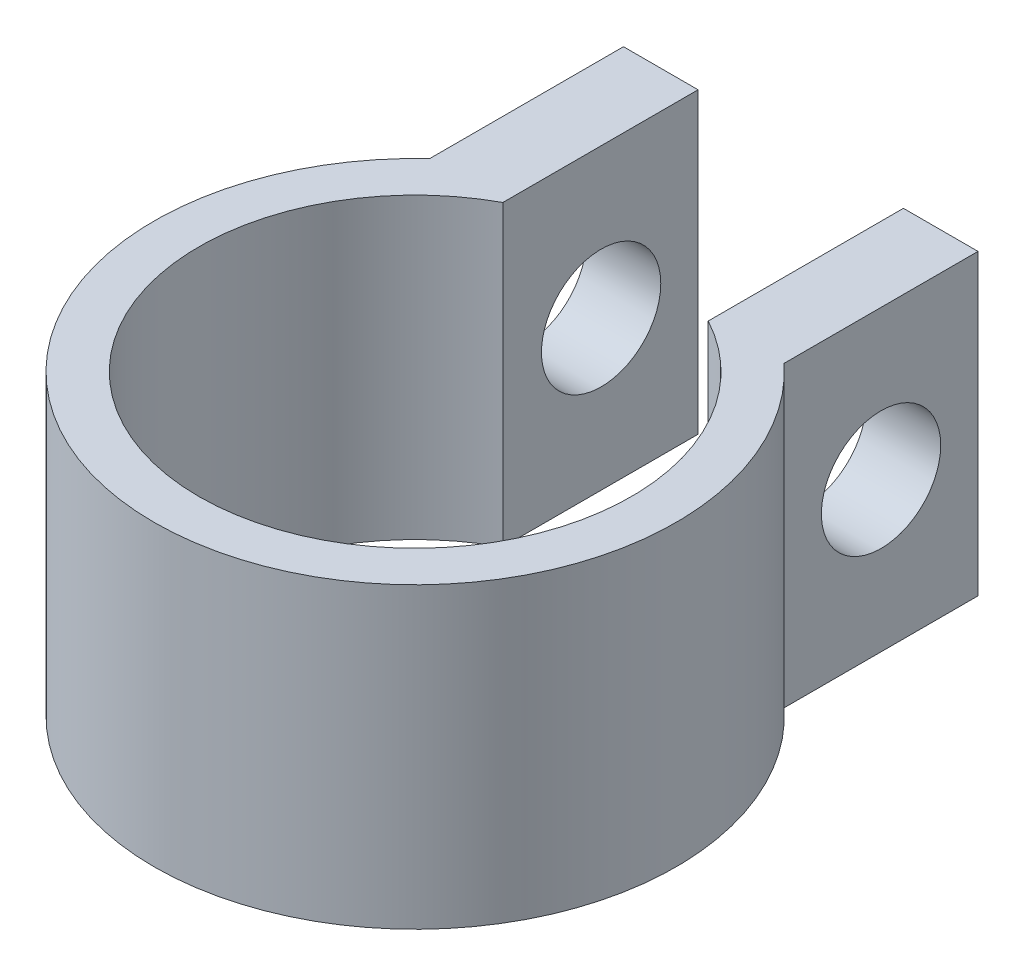
ISO-10303-21;
HEADER;
FILE_DESCRIPTION(('STEP AP214'),'2;1');
FILE_NAME('part.step','',(''),(''),'','','');
FILE_SCHEMA(('AUTOMOTIVE_DESIGN { 1 0 10303 214 1 1 1 1 }'));
ENDSEC;
DATA;
#1=APPLICATION_CONTEXT('core data for automotive mechanical design processes');
#2=APPLICATION_PROTOCOL_DEFINITION('international standard','automotive_design',2000,#1);
#3=PRODUCT_CONTEXT('',#1,'mechanical');
#4=PRODUCT('Part','Part','',(#3));
#5=PRODUCT_RELATED_PRODUCT_CATEGORY('part','',(#4));
#6=PRODUCT_DEFINITION_FORMATION('','',#4);
#7=PRODUCT_DEFINITION_CONTEXT('part definition',#1,'design');
#8=PRODUCT_DEFINITION('design','',#6,#7);
#9=PRODUCT_DEFINITION_SHAPE('','',#8);
#10=(LENGTH_UNIT() NAMED_UNIT(*) SI_UNIT(.MILLI.,.METRE.));
#11=(NAMED_UNIT(*) PLANE_ANGLE_UNIT() SI_UNIT($,.RADIAN.));
#12=(NAMED_UNIT(*) SI_UNIT($,.STERADIAN.) SOLID_ANGLE_UNIT());
#13=UNCERTAINTY_MEASURE_WITH_UNIT(LENGTH_MEASURE(1.E-05),#10,'distance_accuracy_value','');
#14=(GEOMETRIC_REPRESENTATION_CONTEXT(3) GLOBAL_UNCERTAINTY_ASSIGNED_CONTEXT((#13)) GLOBAL_UNIT_ASSIGNED_CONTEXT((#10,
#11,#12)) REPRESENTATION_CONTEXT('',''));
#15=CARTESIAN_POINT('',(0.,0.,0.));
#16=DIRECTION('',(0.,0.,1.));
#17=DIRECTION('',(1.,0.,0.));
#18=AXIS2_PLACEMENT_3D('',#15,#16,#17);
#19=CARTESIAN_POINT('',(0.,10.,0.));
#20=DIRECTION('',(0.,-1.,0.));
#21=DIRECTION('',(0.,0.,-1.));
#22=AXIS2_PLACEMENT_3D('',#19,#20,#21);
#23=CYLINDRICAL_SURFACE('',#22,7.25);
#24=CARTESIAN_POINT('',(0.,0.,0.));
#25=DIRECTION('',(0.,1.,0.));
#26=DIRECTION('',(0.,0.,1.));
#27=AXIS2_PLACEMENT_3D('',#24,#25,#26);
#28=CIRCLE('',#27,7.25);
#29=CARTESIAN_POINT('',(-3.44115529402414,0.,-6.38129690912511));
#30=VERTEX_POINT('',#29);
#31=CARTESIAN_POINT('',(3.44115529402414,0.,-6.38129690912511));
#32=VERTEX_POINT('',#31);
#33=EDGE_CURVE('E132',#30,#32,#28,.T.);
#34=ORIENTED_EDGE('',*,*,#33,.F.);
#35=DIRECTION('',(0.,-1.,0.));
#36=VECTOR('',#35,1.);
#37=CARTESIAN_POINT('',(-3.44115529402414,10.,-6.38129690912511));
#38=LINE('',#37,#36);
#39=CARTESIAN_POINT('',(-3.44115529402414,10.,-6.38129690912511));
#40=VERTEX_POINT('',#39);
#41=EDGE_CURVE('E11',#40,#30,#38,.T.);
#42=ORIENTED_EDGE('',*,*,#41,.F.);
#43=CARTESIAN_POINT('',(0.,10.,0.));
#44=DIRECTION('',(0.,1.,0.));
#45=DIRECTION('',(0.,0.,1.));
#46=AXIS2_PLACEMENT_3D('',#43,#44,#45);
#47=CIRCLE('',#46,7.25);
#48=CARTESIAN_POINT('',(3.44115529402414,10.,-6.38129690912511));
#49=VERTEX_POINT('',#48);
#50=EDGE_CURVE('E151',#40,#49,#47,.T.);
#51=ORIENTED_EDGE('',*,*,#50,.T.);
#52=DIRECTION('',(0.,-1.,0.));
#53=VECTOR('',#52,1.);
#54=CARTESIAN_POINT('',(3.44115529402414,10.,-6.38129690912511));
#55=LINE('',#54,#53);
#56=EDGE_CURVE('E90',#49,#32,#55,.T.);
#57=ORIENTED_EDGE('',*,*,#56,.T.);
#58=EDGE_LOOP('',(#34,#42,#51,#57));
#59=FACE_BOUND('',#58,.T.);
#60=ADVANCED_FACE('F38',(#59),#23,.F.);
#61=CARTESIAN_POINT('',(-3.44115529402414,10.,0.));
#62=DIRECTION('',(1.,0.,0.));
#63=DIRECTION('',(0.,0.,-1.));
#64=AXIS2_PLACEMENT_3D('',#61,#62,#63);
#65=PLANE('',#64);
#66=CARTESIAN_POINT('',(-3.44115529402414,5.,-9.67379745729027));
#67=DIRECTION('',(1.,0.,0.));
#68=DIRECTION('',(0.,0.,-1.));
#69=AXIS2_PLACEMENT_3D('',#66,#67,#68);
#70=CIRCLE('',#69,2.);
#71=CARTESIAN_POINT('',(-3.44115529402414,5.,-11.6737974572903));
#72=VERTEX_POINT('',#71);
#73=EDGE_CURVE('E136',#72,#72,#70,.T.);
#74=ORIENTED_EDGE('',*,*,#73,.F.);
#75=EDGE_LOOP('',(#74));
#76=FACE_BOUND('',#75,.T.);
#77=DIRECTION('',(0.,0.,1.));
#78=VECTOR('',#77,1.);
#79=CARTESIAN_POINT('',(-3.44115529402414,0.,0.));
#80=LINE('',#79,#78);
#81=CARTESIAN_POINT('',(-3.44115529402414,0.,-12.9237974572903));
#82=VERTEX_POINT('',#81);
#83=EDGE_CURVE('E135',#82,#30,#80,.T.);
#84=ORIENTED_EDGE('',*,*,#83,.F.);
#85=DIRECTION('',(0.,-1.,0.));
#86=VECTOR('',#85,1.);
#87=CARTESIAN_POINT('',(-3.44115529402414,10.,-12.9237974572903));
#88=LINE('',#87,#86);
#89=CARTESIAN_POINT('',(-3.44115529402414,10.,-12.9237974572903));
#90=VERTEX_POINT('',#89);
#91=EDGE_CURVE('E47',#90,#82,#88,.T.);
#92=ORIENTED_EDGE('',*,*,#91,.F.);
#93=DIRECTION('',(0.,0.,1.));
#94=VECTOR('',#93,1.);
#95=CARTESIAN_POINT('',(-3.44115529402414,10.,0.));
#96=LINE('',#95,#94);
#97=EDGE_CURVE('E178',#90,#40,#96,.T.);
#98=ORIENTED_EDGE('',*,*,#97,.T.);
#99=ORIENTED_EDGE('',*,*,#41,.T.);
#100=EDGE_LOOP('',(#84,#92,#98,#99));
#101=FACE_BOUND('',#100,.T.);
#102=ADVANCED_FACE('F169',(#76,#101),#65,.T.);
#103=CARTESIAN_POINT('',(0.,10.,-12.9237974572903));
#104=DIRECTION('',(0.,0.,-1.));
#105=DIRECTION('',(-1.,0.,0.));
#106=AXIS2_PLACEMENT_3D('',#103,#104,#105);
#107=PLANE('',#106);
#108=DIRECTION('',(1.,0.,0.));
#109=VECTOR('',#108,1.);
#110=CARTESIAN_POINT('',(0.,0.,-12.9237974572903));
#111=LINE('',#110,#109);
#112=CARTESIAN_POINT('',(-5.94115529402414,0.,-12.9237974572903));
#113=VERTEX_POINT('',#112);
#114=EDGE_CURVE('E139',#113,#82,#111,.T.);
#115=ORIENTED_EDGE('',*,*,#114,.F.);
#116=DIRECTION('',(0.,-1.,0.));
#117=VECTOR('',#116,1.);
#118=CARTESIAN_POINT('',(-5.94115529402414,10.,-12.9237974572903));
#119=LINE('',#118,#117);
#120=CARTESIAN_POINT('',(-5.94115529402414,10.,-12.9237974572903));
#121=VERTEX_POINT('',#120);
#122=EDGE_CURVE('E157',#121,#113,#119,.T.);
#123=ORIENTED_EDGE('',*,*,#122,.F.);
#124=DIRECTION('',(1.,0.,0.));
#125=VECTOR('',#124,1.);
#126=CARTESIAN_POINT('',(0.,10.,-12.9237974572903));
#127=LINE('',#126,#125);
#128=EDGE_CURVE('E165',#121,#90,#127,.T.);
#129=ORIENTED_EDGE('',*,*,#128,.T.);
#130=ORIENTED_EDGE('',*,*,#91,.T.);
#131=EDGE_LOOP('',(#115,#123,#129,#130));
#132=FACE_BOUND('',#131,.T.);
#133=ADVANCED_FACE('F163',(#132),#107,.T.);
#134=CARTESIAN_POINT('',(-5.94115529402414,10.,0.));
#135=DIRECTION('',(-1.,0.,0.));
#136=DIRECTION('',(0.,0.,1.));
#137=AXIS2_PLACEMENT_3D('',#134,#135,#136);
#138=PLANE('',#137);
#139=CARTESIAN_POINT('',(-5.94115529402414,5.,-9.67379745729027));
#140=DIRECTION('',(-1.,0.,0.));
#141=DIRECTION('',(0.,0.,1.));
#142=AXIS2_PLACEMENT_3D('',#139,#140,#141);
#143=CIRCLE('',#142,2.);
#144=CARTESIAN_POINT('',(-5.94115529402414,5.,-7.67379745729027));
#145=VERTEX_POINT('',#144);
#146=EDGE_CURVE('E186',#145,#145,#143,.T.);
#147=ORIENTED_EDGE('',*,*,#146,.F.);
#148=EDGE_LOOP('',(#147));
#149=FACE_BOUND('',#148,.T.);
#150=DIRECTION('',(0.,0.,-1.));
#151=VECTOR('',#150,1.);
#152=CARTESIAN_POINT('',(-5.94115529402414,0.,0.));
#153=LINE('',#152,#151);
#154=CARTESIAN_POINT('',(-5.94115529402414,0.,-6.42379745729027));
#155=VERTEX_POINT('',#154);
#156=EDGE_CURVE('E142',#155,#113,#153,.T.);
#157=ORIENTED_EDGE('',*,*,#156,.F.);
#158=DIRECTION('',(0.,-1.,0.));
#159=VECTOR('',#158,1.);
#160=CARTESIAN_POINT('',(-5.94115529402414,10.,-6.42379745729027));
#161=LINE('',#160,#159);
#162=CARTESIAN_POINT('',(-5.94115529402414,10.,-6.42379745729027));
#163=VERTEX_POINT('',#162);
#164=EDGE_CURVE('E155',#163,#155,#161,.T.);
#165=ORIENTED_EDGE('',*,*,#164,.F.);
#166=DIRECTION('',(0.,0.,-1.));
#167=VECTOR('',#166,1.);
#168=CARTESIAN_POINT('',(-5.94115529402414,10.,0.));
#169=LINE('',#168,#167);
#170=EDGE_CURVE('E177',#163,#121,#169,.T.);
#171=ORIENTED_EDGE('',*,*,#170,.T.);
#172=ORIENTED_EDGE('',*,*,#122,.T.);
#173=EDGE_LOOP('',(#157,#165,#171,#172));
#174=FACE_BOUND('',#173,.T.);
#175=ADVANCED_FACE('F175',(#149,#174),#138,.T.);
#176=CARTESIAN_POINT('',(0.,10.,0.));
#177=DIRECTION('',(0.,-1.,0.));
#178=DIRECTION('',(0.,0.,-1.));
#179=AXIS2_PLACEMENT_3D('',#176,#177,#178);
#180=CYLINDRICAL_SURFACE('',#179,8.75);
#181=CARTESIAN_POINT('',(0.,0.,0.));
#182=DIRECTION('',(0.,1.,0.));
#183=DIRECTION('',(0.,0.,1.));
#184=AXIS2_PLACEMENT_3D('',#181,#182,#183);
#185=CIRCLE('',#184,8.75);
#186=CARTESIAN_POINT('',(5.94115529402414,0.,-6.42379745729027));
#187=VERTEX_POINT('',#186);
#188=EDGE_CURVE('E145',#155,#187,#185,.T.);
#189=ORIENTED_EDGE('',*,*,#188,.T.);
#190=DIRECTION('',(0.,-1.,0.));
#191=VECTOR('',#190,1.);
#192=CARTESIAN_POINT('',(5.94115529402414,10.,-6.42379745729027));
#193=LINE('',#192,#191);
#194=CARTESIAN_POINT('',(5.94115529402414,10.,-6.42379745729027));
#195=VERTEX_POINT('',#194);
#196=EDGE_CURVE('E124',#195,#187,#193,.T.);
#197=ORIENTED_EDGE('',*,*,#196,.F.);
#198=CARTESIAN_POINT('',(0.,10.,0.));
#199=DIRECTION('',(0.,1.,0.));
#200=DIRECTION('',(0.,0.,1.));
#201=AXIS2_PLACEMENT_3D('',#198,#199,#200);
#202=CIRCLE('',#201,8.75);
#203=EDGE_CURVE('E115',#163,#195,#202,.T.);
#204=ORIENTED_EDGE('',*,*,#203,.F.);
#205=ORIENTED_EDGE('',*,*,#164,.T.);
#206=EDGE_LOOP('',(#189,#197,#204,#205));
#207=FACE_BOUND('',#206,.T.);
#208=ADVANCED_FACE('F226',(#207),#180,.T.);
#209=CARTESIAN_POINT('',(5.94115529402414,10.,0.));
#210=DIRECTION('',(-1.,0.,0.));
#211=DIRECTION('',(0.,0.,1.));
#212=AXIS2_PLACEMENT_3D('',#209,#210,#211);
#213=PLANE('',#212);
#214=CARTESIAN_POINT('',(5.94115529402414,5.,-9.67379745729027));
#215=DIRECTION('',(1.,0.,0.));
#216=DIRECTION('',(0.,0.,-1.));
#217=AXIS2_PLACEMENT_3D('',#214,#215,#216);
#218=CIRCLE('',#217,2.);
#219=CARTESIAN_POINT('',(5.94115529402414,5.,-11.6737974572903));
#220=VERTEX_POINT('',#219);
#221=EDGE_CURVE('E189',#220,#220,#218,.T.);
#222=ORIENTED_EDGE('',*,*,#221,.F.);
#223=EDGE_LOOP('',(#222));
#224=FACE_BOUND('',#223,.T.);
#225=DIRECTION('',(0.,0.,-1.));
#226=VECTOR('',#225,1.);
#227=CARTESIAN_POINT('',(5.94115529402414,0.,0.));
#228=LINE('',#227,#226);
#229=CARTESIAN_POINT('',(5.94115529402414,0.,-12.9237974572903));
#230=VERTEX_POINT('',#229);
#231=EDGE_CURVE('E123',#187,#230,#228,.T.);
#232=ORIENTED_EDGE('',*,*,#231,.T.);
#233=DIRECTION('',(0.,-1.,0.));
#234=VECTOR('',#233,1.);
#235=CARTESIAN_POINT('',(5.94115529402414,10.,-12.9237974572903));
#236=LINE('',#235,#234);
#237=CARTESIAN_POINT('',(5.94115529402414,10.,-12.9237974572903));
#238=VERTEX_POINT('',#237);
#239=EDGE_CURVE('E120',#238,#230,#236,.T.);
#240=ORIENTED_EDGE('',*,*,#239,.F.);
#241=DIRECTION('',(0.,0.,-1.));
#242=VECTOR('',#241,1.);
#243=CARTESIAN_POINT('',(5.94115529402414,10.,0.));
#244=LINE('',#243,#242);
#245=EDGE_CURVE('E108',#195,#238,#244,.T.);
#246=ORIENTED_EDGE('',*,*,#245,.F.);
#247=ORIENTED_EDGE('',*,*,#196,.T.);
#248=EDGE_LOOP('',(#232,#240,#246,#247));
#249=FACE_BOUND('',#248,.T.);
#250=ADVANCED_FACE('F121',(#224,#249),#213,.F.);
#251=CARTESIAN_POINT('',(0.,10.,-12.9237974572903));
#252=DIRECTION('',(0.,0.,1.));
#253=DIRECTION('',(1.,0.,0.));
#254=AXIS2_PLACEMENT_3D('',#251,#252,#253);
#255=PLANE('',#254);
#256=DIRECTION('',(-1.,0.,0.));
#257=VECTOR('',#256,1.);
#258=CARTESIAN_POINT('',(0.,0.,-12.9237974572903));
#259=LINE('',#258,#257);
#260=CARTESIAN_POINT('',(3.44115529402414,0.,-12.9237974572903));
#261=VERTEX_POINT('',#260);
#262=EDGE_CURVE('E83',#230,#261,#259,.T.);
#263=ORIENTED_EDGE('',*,*,#262,.T.);
#264=DIRECTION('',(0.,-1.,0.));
#265=VECTOR('',#264,1.);
#266=CARTESIAN_POINT('',(3.44115529402414,10.,-12.9237974572903));
#267=LINE('',#266,#265);
#268=CARTESIAN_POINT('',(3.44115529402414,10.,-12.9237974572903));
#269=VERTEX_POINT('',#268);
#270=EDGE_CURVE('E125',#269,#261,#267,.T.);
#271=ORIENTED_EDGE('',*,*,#270,.F.);
#272=DIRECTION('',(-1.,0.,0.));
#273=VECTOR('',#272,1.);
#274=CARTESIAN_POINT('',(0.,10.,-12.9237974572903));
#275=LINE('',#274,#273);
#276=EDGE_CURVE('E112',#238,#269,#275,.T.);
#277=ORIENTED_EDGE('',*,*,#276,.F.);
#278=ORIENTED_EDGE('',*,*,#239,.T.);
#279=EDGE_LOOP('',(#263,#271,#277,#278));
#280=FACE_BOUND('',#279,.T.);
#281=ADVANCED_FACE('F127',(#280),#255,.F.);
#282=CARTESIAN_POINT('',(3.44115529402413,10.,0.));
#283=DIRECTION('',(1.,0.,0.));
#284=DIRECTION('',(0.,0.,-1.));
#285=AXIS2_PLACEMENT_3D('',#282,#283,#284);
#286=PLANE('',#285);
#287=CARTESIAN_POINT('',(3.44115529402413,5.,-9.67379745729027));
#288=DIRECTION('',(1.,0.,0.));
#289=DIRECTION('',(0.,0.,-1.));
#290=AXIS2_PLACEMENT_3D('',#287,#288,#289);
#291=CIRCLE('',#290,2.);
#292=CARTESIAN_POINT('',(3.44115529402413,5.,-11.6737974572903));
#293=VERTEX_POINT('',#292);
#294=EDGE_CURVE('E41',#293,#293,#291,.T.);
#295=ORIENTED_EDGE('',*,*,#294,.T.);
#296=EDGE_LOOP('',(#295));
#297=FACE_BOUND('',#296,.T.);
#298=DIRECTION('',(0.,0.,1.));
#299=VECTOR('',#298,1.);
#300=CARTESIAN_POINT('',(3.44115529402413,0.,0.));
#301=LINE('',#300,#299);
#302=EDGE_CURVE('E149',#261,#32,#301,.T.);
#303=ORIENTED_EDGE('',*,*,#302,.T.);
#304=ORIENTED_EDGE('',*,*,#56,.F.);
#305=DIRECTION('',(0.,0.,1.));
#306=VECTOR('',#305,1.);
#307=CARTESIAN_POINT('',(3.44115529402413,10.,0.));
#308=LINE('',#307,#306);
#309=EDGE_CURVE('E55',#269,#49,#308,.T.);
#310=ORIENTED_EDGE('',*,*,#309,.F.);
#311=ORIENTED_EDGE('',*,*,#270,.T.);
#312=EDGE_LOOP('',(#303,#304,#310,#311));
#313=FACE_BOUND('',#312,.T.);
#314=ADVANCED_FACE('F196',(#297,#313),#286,.F.);
#315=CARTESIAN_POINT('',(0.,10.,0.));
#316=DIRECTION('',(0.,1.,0.));
#317=DIRECTION('',(0.,0.,1.));
#318=AXIS2_PLACEMENT_3D('',#315,#316,#317);
#319=PLANE('',#318);
#320=ORIENTED_EDGE('',*,*,#50,.F.);
#321=ORIENTED_EDGE('',*,*,#97,.F.);
#322=ORIENTED_EDGE('',*,*,#128,.F.);
#323=ORIENTED_EDGE('',*,*,#170,.F.);
#324=ORIENTED_EDGE('',*,*,#203,.T.);
#325=ORIENTED_EDGE('',*,*,#245,.T.);
#326=ORIENTED_EDGE('',*,*,#276,.T.);
#327=ORIENTED_EDGE('',*,*,#309,.T.);
#328=EDGE_LOOP('',(#320,#321,#322,#323,#324,#325,#326,#327));
#329=FACE_BOUND('',#328,.T.);
#330=ADVANCED_FACE('F110',(#329),#319,.T.);
#331=CARTESIAN_POINT('',(0.,0.,0.));
#332=DIRECTION('',(0.,1.,0.));
#333=DIRECTION('',(0.,0.,1.));
#334=AXIS2_PLACEMENT_3D('',#331,#332,#333);
#335=PLANE('',#334);
#336=ORIENTED_EDGE('',*,*,#33,.T.);
#337=ORIENTED_EDGE('',*,*,#302,.F.);
#338=ORIENTED_EDGE('',*,*,#262,.F.);
#339=ORIENTED_EDGE('',*,*,#231,.F.);
#340=ORIENTED_EDGE('',*,*,#188,.F.);
#341=ORIENTED_EDGE('',*,*,#156,.T.);
#342=ORIENTED_EDGE('',*,*,#114,.T.);
#343=ORIENTED_EDGE('',*,*,#83,.T.);
#344=EDGE_LOOP('',(#336,#337,#338,#339,#340,#341,#342,#343));
#345=FACE_BOUND('',#344,.T.);
#346=ADVANCED_FACE('F171',(#345),#335,.F.);
#347=CARTESIAN_POINT('',(-8.75,5.,-9.67379745729027));
#348=DIRECTION('',(1.,0.,0.));
#349=DIRECTION('',(0.,0.,-1.));
#350=AXIS2_PLACEMENT_3D('',#347,#348,#349);
#351=CYLINDRICAL_SURFACE('',#350,2.);
#352=ORIENTED_EDGE('',*,*,#221,.T.);
#353=EDGE_LOOP('',(#352));
#354=FACE_BOUND('',#353,.T.);
#355=ORIENTED_EDGE('',*,*,#294,.F.);
#356=EDGE_LOOP('',(#355));
#357=FACE_BOUND('',#356,.T.);
#358=ADVANCED_FACE('F199',(#354,#357),#351,.F.);
#359=ORIENTED_EDGE('',*,*,#73,.T.);
#360=EDGE_LOOP('',(#359));
#361=FACE_BOUND('',#360,.T.);
#362=ORIENTED_EDGE('',*,*,#146,.T.);
#363=EDGE_LOOP('',(#362));
#364=FACE_BOUND('',#363,.T.);
#365=ADVANCED_FACE('F201',(#361,#364),#351,.F.);
#366=CLOSED_SHELL('',(#60,#102,#133,#175,#208,#250,#281,#314,#330,#346,#358,#365));
#367=MANIFOLD_SOLID_BREP('B2',#366);
#368=ADVANCED_BREP_SHAPE_REPRESENTATION('',(#18,#367),#14);
#369=SHAPE_DEFINITION_REPRESENTATION(#9,#368);
ENDSEC;
END-ISO-10303-21;
